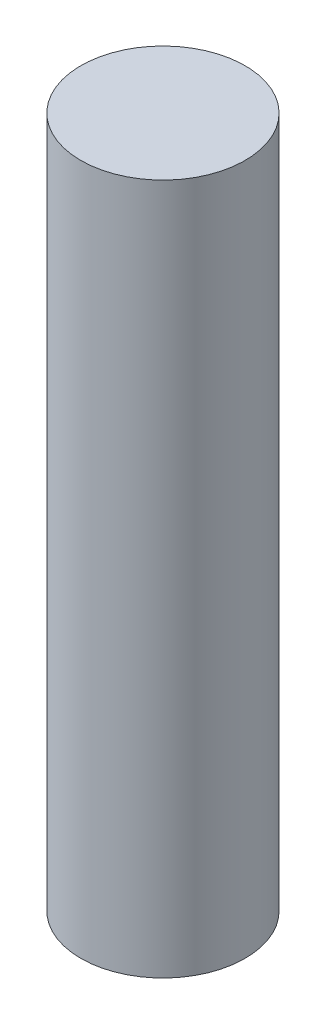
ISO-10303-21;
HEADER;
FILE_DESCRIPTION(('STEP AP214'),'2;1');
FILE_NAME('part.step','',(''),(''),'','','');
FILE_SCHEMA(('AUTOMOTIVE_DESIGN { 1 0 10303 214 1 1 1 1 }'));
ENDSEC;
DATA;
#1=APPLICATION_CONTEXT('core data for automotive mechanical design processes');
#2=APPLICATION_PROTOCOL_DEFINITION('international standard','automotive_design',2000,#1);
#3=PRODUCT_CONTEXT('',#1,'mechanical');
#4=PRODUCT('Part','Part','',(#3));
#5=PRODUCT_RELATED_PRODUCT_CATEGORY('part','',(#4));
#6=PRODUCT_DEFINITION_FORMATION('','',#4);
#7=PRODUCT_DEFINITION_CONTEXT('part definition',#1,'design');
#8=PRODUCT_DEFINITION('design','',#6,#7);
#9=PRODUCT_DEFINITION_SHAPE('','',#8);
#10=(LENGTH_UNIT() NAMED_UNIT(*) SI_UNIT(.MILLI.,.METRE.));
#11=(NAMED_UNIT(*) PLANE_ANGLE_UNIT() SI_UNIT($,.RADIAN.));
#12=(NAMED_UNIT(*) SI_UNIT($,.STERADIAN.) SOLID_ANGLE_UNIT());
#13=UNCERTAINTY_MEASURE_WITH_UNIT(LENGTH_MEASURE(1.E-05),#10,'distance_accuracy_value','');
#14=(GEOMETRIC_REPRESENTATION_CONTEXT(3) GLOBAL_UNCERTAINTY_ASSIGNED_CONTEXT((#13)) GLOBAL_UNIT_ASSIGNED_CONTEXT((#10,
#11,#12)) REPRESENTATION_CONTEXT('',''));
#15=CARTESIAN_POINT('',(0.,0.,0.));
#16=DIRECTION('',(0.,0.,1.));
#17=DIRECTION('',(1.,0.,0.));
#18=AXIS2_PLACEMENT_3D('',#15,#16,#17);
#19=CARTESIAN_POINT('',(-1.86956836129967,33.655,-3.17260085553883));
#20=DIRECTION('',(0.,-1.,0.));
#21=DIRECTION('',(0.,0.,-1.));
#22=AXIS2_PLACEMENT_3D('',#19,#20,#21);
#23=CYLINDRICAL_SURFACE('',#22,4.);
#24=CARTESIAN_POINT('',(-1.86956836129967,33.655,-3.17260085553883));
#25=DIRECTION('',(0.,1.,0.));
#26=DIRECTION('',(0.,0.,1.));
#27=AXIS2_PLACEMENT_3D('',#24,#25,#26);
#28=CIRCLE('',#27,4.);
#29=CARTESIAN_POINT('',(-1.86956836129967,33.655,0.827399144461172));
#30=VERTEX_POINT('',#29);
#31=EDGE_CURVE('E10',#30,#30,#28,.T.);
#32=ORIENTED_EDGE('',*,*,#31,.F.);
#33=EDGE_LOOP('',(#32));
#34=FACE_BOUND('',#33,.T.);
#35=CARTESIAN_POINT('',(-1.86956836129967,0.,-3.17260085553883));
#36=DIRECTION('',(0.,1.,0.));
#37=DIRECTION('',(0.,0.,1.));
#38=AXIS2_PLACEMENT_3D('',#35,#36,#37);
#39=CIRCLE('',#38,4.);
#40=CARTESIAN_POINT('',(-1.86956836129967,0.,0.827399144461172));
#41=VERTEX_POINT('',#40);
#42=EDGE_CURVE('E35',#41,#41,#39,.T.);
#43=ORIENTED_EDGE('',*,*,#42,.T.);
#44=EDGE_LOOP('',(#43));
#45=FACE_BOUND('',#44,.T.);
#46=ADVANCED_FACE('F32',(#34,#45),#23,.T.);
#47=CARTESIAN_POINT('',(-1.86956836129967,33.655,-3.17260085553883));
#48=DIRECTION('',(0.,1.,0.));
#49=DIRECTION('',(0.,0.,1.));
#50=AXIS2_PLACEMENT_3D('',#47,#48,#49);
#51=PLANE('',#50);
#52=ORIENTED_EDGE('',*,*,#31,.T.);
#53=EDGE_LOOP('',(#52));
#54=FACE_BOUND('',#53,.T.);
#55=ADVANCED_FACE('F47',(#54),#51,.T.);
#56=CARTESIAN_POINT('',(-1.86956836129967,0.,-3.17260085553883));
#57=DIRECTION('',(0.,1.,0.));
#58=DIRECTION('',(0.,0.,1.));
#59=AXIS2_PLACEMENT_3D('',#56,#57,#58);
#60=PLANE('',#59);
#61=ORIENTED_EDGE('',*,*,#42,.F.);
#62=EDGE_LOOP('',(#61));
#63=FACE_BOUND('',#62,.T.);
#64=ADVANCED_FACE('F45',(#63),#60,.F.);
#65=CLOSED_SHELL('',(#46,#55,#64));
#66=MANIFOLD_SOLID_BREP('B2',#65);
#67=ADVANCED_BREP_SHAPE_REPRESENTATION('',(#18,#66),#14);
#68=SHAPE_DEFINITION_REPRESENTATION(#9,#67);
ENDSEC;
END-ISO-10303-21;
